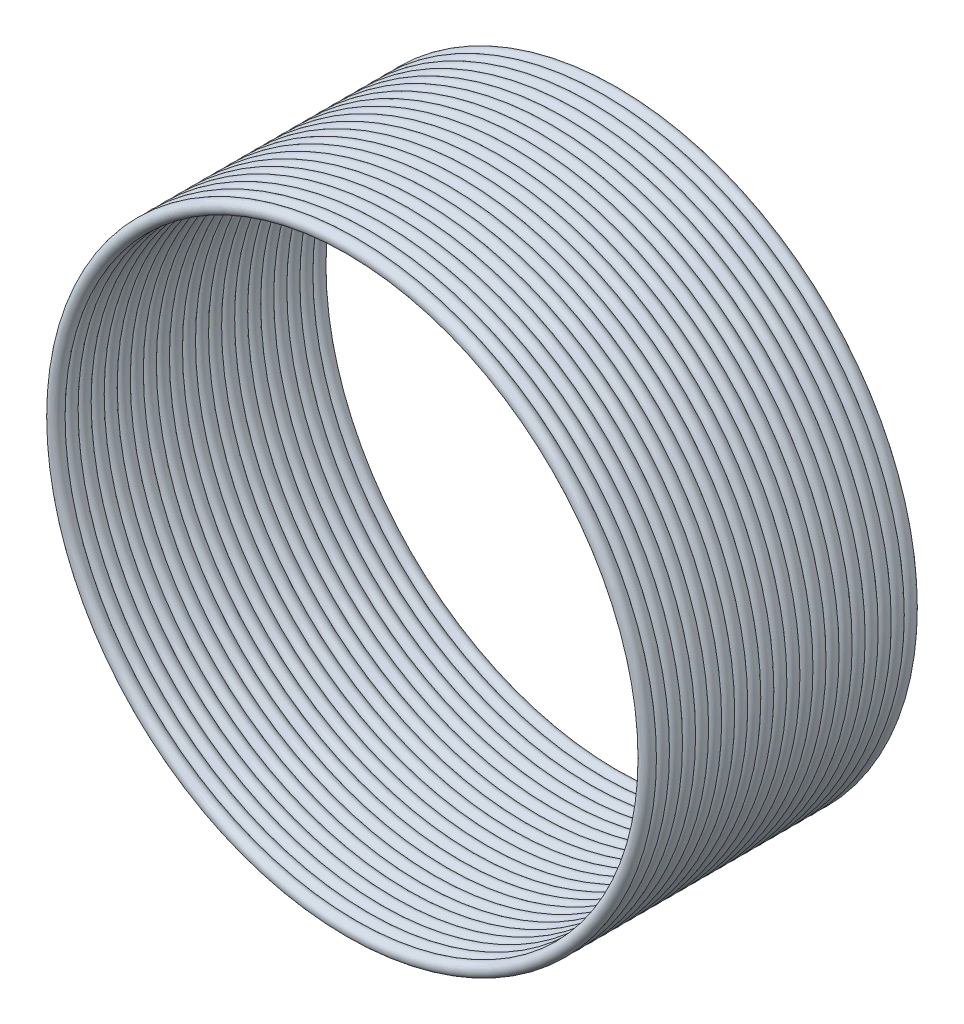
ISO-10303-21;
HEADER;
FILE_DESCRIPTION(('STEP AP214'),'2;1');
FILE_NAME('part.step','',(''),(''),'','','');
FILE_SCHEMA(('AUTOMOTIVE_DESIGN { 1 0 10303 214 1 1 1 1 }'));
ENDSEC;
DATA;
#1=APPLICATION_CONTEXT('core data for automotive mechanical design processes');
#2=APPLICATION_PROTOCOL_DEFINITION('international standard','automotive_design',2000,#1);
#3=PRODUCT_CONTEXT('',#1,'mechanical');
#4=PRODUCT('Part','Part','',(#3));
#5=PRODUCT_RELATED_PRODUCT_CATEGORY('part','',(#4));
#6=PRODUCT_DEFINITION_FORMATION('','',#4);
#7=PRODUCT_DEFINITION_CONTEXT('part definition',#1,'design');
#8=PRODUCT_DEFINITION('design','',#6,#7);
#9=PRODUCT_DEFINITION_SHAPE('','',#8);
#10=(LENGTH_UNIT() NAMED_UNIT(*) SI_UNIT(.MILLI.,.METRE.));
#11=(NAMED_UNIT(*) PLANE_ANGLE_UNIT() SI_UNIT($,.RADIAN.));
#12=(NAMED_UNIT(*) SI_UNIT($,.STERADIAN.) SOLID_ANGLE_UNIT());
#13=UNCERTAINTY_MEASURE_WITH_UNIT(LENGTH_MEASURE(1.E-05),#10,'distance_accuracy_value','');
#14=(GEOMETRIC_REPRESENTATION_CONTEXT(3) GLOBAL_UNCERTAINTY_ASSIGNED_CONTEXT((#13)) GLOBAL_UNIT_ASSIGNED_CONTEXT((#10,
#11,#12)) REPRESENTATION_CONTEXT('',''));
#15=CARTESIAN_POINT('',(0.,0.,0.));
#16=DIRECTION('',(0.,0.,1.));
#17=DIRECTION('',(1.,0.,0.));
#18=AXIS2_PLACEMENT_3D('',#15,#16,#17);
#19=CARTESIAN_POINT('',(0.,0.,3.45));
#20=DIRECTION('',(0.,0.,-1.));
#21=DIRECTION('',(1.,0.,0.));
#22=AXIS2_PLACEMENT_3D('',#19,#20,#21);
#23=TOROIDAL_SURFACE('',#22,3.4,0.075);
#24=ADVANCED_FACE('P0_F14',(),#23,.T.);
#25=CLOSED_SHELL('',(#24));
#26=MANIFOLD_SOLID_BREP('P0_B1',#25);
#27=CARTESIAN_POINT('',(0.,0.,4.05));
#28=DIRECTION('',(0.,0.,-1.));
#29=DIRECTION('',(1.,0.,0.));
#30=AXIS2_PLACEMENT_3D('',#27,#28,#29);
#31=TOROIDAL_SURFACE('',#30,3.4,0.075);
#32=ADVANCED_FACE('P1_F14',(),#31,.T.);
#33=CLOSED_SHELL('',(#32));
#34=MANIFOLD_SOLID_BREP('P1_B1',#33);
#35=CARTESIAN_POINT('',(0.,0.,1.65));
#36=DIRECTION('',(0.,0.,-1.));
#37=DIRECTION('',(1.,0.,0.));
#38=AXIS2_PLACEMENT_3D('',#35,#36,#37);
#39=TOROIDAL_SURFACE('',#38,3.4,0.075);
#40=ADVANCED_FACE('P2_F14',(),#39,.T.);
#41=CLOSED_SHELL('',(#40));
#42=MANIFOLD_SOLID_BREP('P2_B1',#41);
#43=CARTESIAN_POINT('',(0.,0.,2.25));
#44=DIRECTION('',(0.,0.,-1.));
#45=DIRECTION('',(1.,0.,0.));
#46=AXIS2_PLACEMENT_3D('',#43,#44,#45);
#47=TOROIDAL_SURFACE('',#46,3.4,0.075);
#48=ADVANCED_FACE('P3_F14',(),#47,.T.);
#49=CLOSED_SHELL('',(#48));
#50=MANIFOLD_SOLID_BREP('P3_B1',#49);
#51=CARTESIAN_POINT('',(0.,0.,3.9));
#52=DIRECTION('',(0.,0.,-1.));
#53=DIRECTION('',(1.,0.,0.));
#54=AXIS2_PLACEMENT_3D('',#51,#52,#53);
#55=TOROIDAL_SURFACE('',#54,3.4,0.075);
#56=ADVANCED_FACE('P4_F14',(),#55,.T.);
#57=CLOSED_SHELL('',(#56));
#58=MANIFOLD_SOLID_BREP('P4_B1',#57);
#59=CARTESIAN_POINT('',(0.,0.,4.2));
#60=DIRECTION('',(0.,0.,-1.));
#61=DIRECTION('',(1.,0.,0.));
#62=AXIS2_PLACEMENT_3D('',#59,#60,#61);
#63=TOROIDAL_SURFACE('',#62,3.4,0.075);
#64=ADVANCED_FACE('P5_F14',(),#63,.T.);
#65=CLOSED_SHELL('',(#64));
#66=MANIFOLD_SOLID_BREP('P5_B1',#65);
#67=CARTESIAN_POINT('',(0.,0.,2.85));
#68=DIRECTION('',(0.,0.,-1.));
#69=DIRECTION('',(1.,0.,0.));
#70=AXIS2_PLACEMENT_3D('',#67,#68,#69);
#71=TOROIDAL_SURFACE('',#70,3.4,0.075);
#72=ADVANCED_FACE('P6_F14',(),#71,.T.);
#73=CLOSED_SHELL('',(#72));
#74=MANIFOLD_SOLID_BREP('P6_B1',#73);
#75=CARTESIAN_POINT('',(0.,0.,1.8));
#76=DIRECTION('',(0.,0.,-1.));
#77=DIRECTION('',(1.,0.,0.));
#78=AXIS2_PLACEMENT_3D('',#75,#76,#77);
#79=TOROIDAL_SURFACE('',#78,3.4,0.075);
#80=ADVANCED_FACE('P7_F14',(),#79,.T.);
#81=CLOSED_SHELL('',(#80));
#82=MANIFOLD_SOLID_BREP('P7_B1',#81);
#83=CARTESIAN_POINT('',(0.,0.,2.4));
#84=DIRECTION('',(0.,0.,-1.));
#85=DIRECTION('',(1.,0.,0.));
#86=AXIS2_PLACEMENT_3D('',#83,#84,#85);
#87=TOROIDAL_SURFACE('',#86,3.4,0.075);
#88=ADVANCED_FACE('P8_F14',(),#87,.T.);
#89=CLOSED_SHELL('',(#88));
#90=MANIFOLD_SOLID_BREP('P8_B1',#89);
#91=CARTESIAN_POINT('',(0.,0.,3.15));
#92=DIRECTION('',(0.,0.,-1.));
#93=DIRECTION('',(1.,0.,0.));
#94=AXIS2_PLACEMENT_3D('',#91,#92,#93);
#95=TOROIDAL_SURFACE('',#94,3.4,0.075);
#96=ADVANCED_FACE('P9_F14',(),#95,.T.);
#97=CLOSED_SHELL('',(#96));
#98=MANIFOLD_SOLID_BREP('P9_B1',#97);
#99=CARTESIAN_POINT('',(0.,0.,1.2));
#100=DIRECTION('',(0.,0.,-1.));
#101=DIRECTION('',(1.,0.,0.));
#102=AXIS2_PLACEMENT_3D('',#99,#100,#101);
#103=TOROIDAL_SURFACE('',#102,3.4,0.075);
#104=ADVANCED_FACE('P10_F14',(),#103,.T.);
#105=CLOSED_SHELL('',(#104));
#106=MANIFOLD_SOLID_BREP('P10_B1',#105);
#107=CARTESIAN_POINT('',(0.,0.,2.1));
#108=DIRECTION('',(0.,0.,-1.));
#109=DIRECTION('',(1.,0.,0.));
#110=AXIS2_PLACEMENT_3D('',#107,#108,#109);
#111=TOROIDAL_SURFACE('',#110,3.4,0.075);
#112=ADVANCED_FACE('P11_F14',(),#111,.T.);
#113=CLOSED_SHELL('',(#112));
#114=MANIFOLD_SOLID_BREP('P11_B1',#113);
#115=CARTESIAN_POINT('',(0.,0.,3.6));
#116=DIRECTION('',(0.,0.,-1.));
#117=DIRECTION('',(1.,0.,0.));
#118=AXIS2_PLACEMENT_3D('',#115,#116,#117);
#119=TOROIDAL_SURFACE('',#118,3.4,0.075);
#120=ADVANCED_FACE('P12_F14',(),#119,.T.);
#121=CLOSED_SHELL('',(#120));
#122=MANIFOLD_SOLID_BREP('P12_B1',#121);
#123=CARTESIAN_POINT('',(0.,0.,2.55));
#124=DIRECTION('',(0.,0.,-1.));
#125=DIRECTION('',(1.,0.,0.));
#126=AXIS2_PLACEMENT_3D('',#123,#124,#125);
#127=TOROIDAL_SURFACE('',#126,3.4,0.075);
#128=ADVANCED_FACE('P13_F14',(),#127,.T.);
#129=CLOSED_SHELL('',(#128));
#130=MANIFOLD_SOLID_BREP('P13_B1',#129);
#131=CARTESIAN_POINT('',(0.,0.,1.5));
#132=DIRECTION('',(0.,0.,-1.));
#133=DIRECTION('',(1.,0.,0.));
#134=AXIS2_PLACEMENT_3D('',#131,#132,#133);
#135=TOROIDAL_SURFACE('',#134,3.4,0.075);
#136=ADVANCED_FACE('P14_F14',(),#135,.T.);
#137=CLOSED_SHELL('',(#136));
#138=MANIFOLD_SOLID_BREP('P14_B1',#137);
#139=CARTESIAN_POINT('',(0.,0.,1.95));
#140=DIRECTION('',(0.,0.,-1.));
#141=DIRECTION('',(1.,0.,0.));
#142=AXIS2_PLACEMENT_3D('',#139,#140,#141);
#143=TOROIDAL_SURFACE('',#142,3.4,0.075);
#144=ADVANCED_FACE('P15_F14',(),#143,.T.);
#145=CLOSED_SHELL('',(#144));
#146=MANIFOLD_SOLID_BREP('P15_B1',#145);
#147=CARTESIAN_POINT('',(0.,0.,3.75));
#148=DIRECTION('',(0.,0.,-1.));
#149=DIRECTION('',(1.,0.,0.));
#150=AXIS2_PLACEMENT_3D('',#147,#148,#149);
#151=TOROIDAL_SURFACE('',#150,3.4,0.075);
#152=ADVANCED_FACE('P16_F14',(),#151,.T.);
#153=CLOSED_SHELL('',(#152));
#154=MANIFOLD_SOLID_BREP('P16_B1',#153);
#155=CARTESIAN_POINT('',(0.,0.,3.3));
#156=DIRECTION('',(0.,0.,-1.));
#157=DIRECTION('',(1.,0.,0.));
#158=AXIS2_PLACEMENT_3D('',#155,#156,#157);
#159=TOROIDAL_SURFACE('',#158,3.4,0.075);
#160=ADVANCED_FACE('P17_F14',(),#159,.T.);
#161=CLOSED_SHELL('',(#160));
#162=MANIFOLD_SOLID_BREP('P17_B1',#161);
#163=CARTESIAN_POINT('',(0.,0.,3.));
#164=DIRECTION('',(0.,0.,-1.));
#165=DIRECTION('',(1.,0.,0.));
#166=AXIS2_PLACEMENT_3D('',#163,#164,#165);
#167=TOROIDAL_SURFACE('',#166,3.4,0.075);
#168=ADVANCED_FACE('P18_F14',(),#167,.T.);
#169=CLOSED_SHELL('',(#168));
#170=MANIFOLD_SOLID_BREP('P18_B1',#169);
#171=CARTESIAN_POINT('',(0.,0.,2.7));
#172=DIRECTION('',(0.,0.,-1.));
#173=DIRECTION('',(1.,0.,0.));
#174=AXIS2_PLACEMENT_3D('',#171,#172,#173);
#175=TOROIDAL_SURFACE('',#174,3.4,0.075);
#176=ADVANCED_FACE('P19_F14',(),#175,.T.);
#177=CLOSED_SHELL('',(#176));
#178=MANIFOLD_SOLID_BREP('P19_B1',#177);
#179=CARTESIAN_POINT('',(0.,0.,1.35));
#180=DIRECTION('',(0.,0.,-1.));
#181=DIRECTION('',(1.,0.,0.));
#182=AXIS2_PLACEMENT_3D('',#179,#180,#181);
#183=TOROIDAL_SURFACE('',#182,3.4,0.075);
#184=ADVANCED_FACE('P20_F14',(),#183,.T.);
#185=CLOSED_SHELL('',(#184));
#186=MANIFOLD_SOLID_BREP('P20_B1',#185);
#187=ADVANCED_BREP_SHAPE_REPRESENTATION('',(#18,#26,#34,#42,#50,#58,#66,#74,#82,#90,#98,#106,
#114,#122,#130,#138,#146,#154,#162,#170,#178,#186),#14);
#188=SHAPE_DEFINITION_REPRESENTATION(#9,#187);
ENDSEC;
END-ISO-10303-21;
